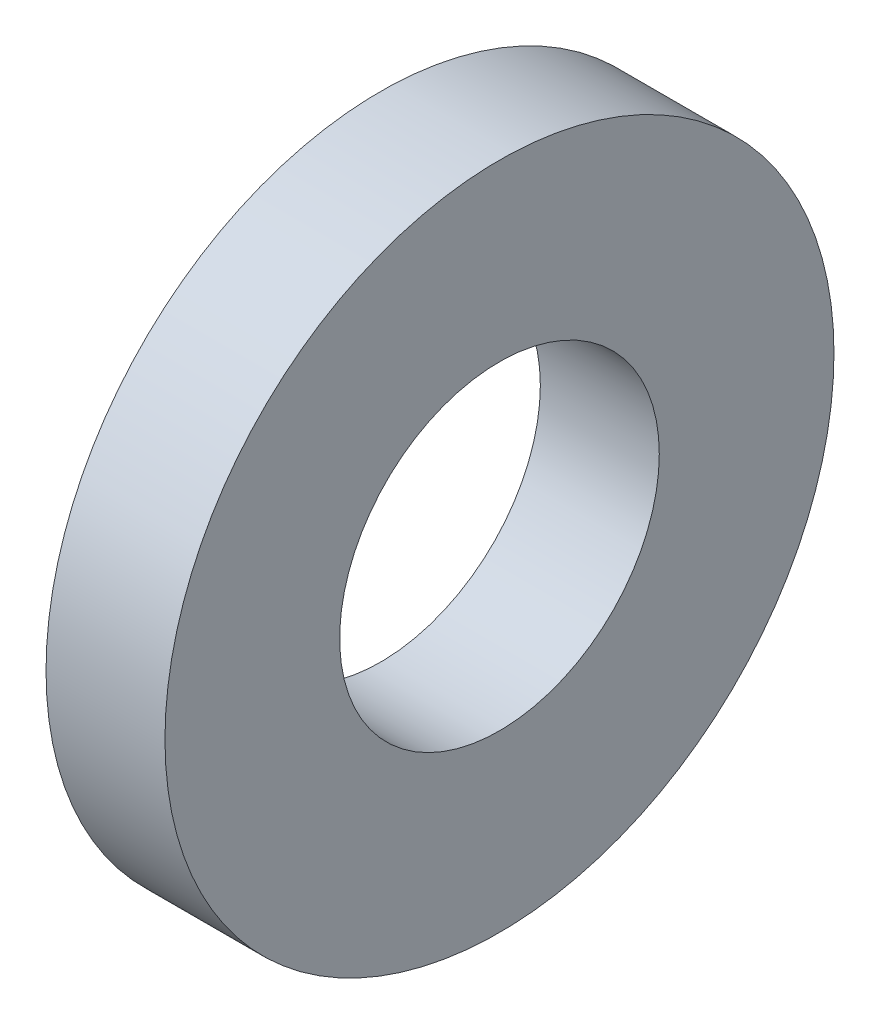
ISO-10303-21;
HEADER;
FILE_DESCRIPTION(('STEP AP214'),'2;1');
FILE_NAME('part.step','',(''),(''),'','','');
FILE_SCHEMA(('AUTOMOTIVE_DESIGN { 1 0 10303 214 1 1 1 1 }'));
ENDSEC;
DATA;
#1=APPLICATION_CONTEXT('core data for automotive mechanical design processes');
#2=APPLICATION_PROTOCOL_DEFINITION('international standard','automotive_design',2000,#1);
#3=PRODUCT_CONTEXT('',#1,'mechanical');
#4=PRODUCT('Part','Part','',(#3));
#5=PRODUCT_RELATED_PRODUCT_CATEGORY('part','',(#4));
#6=PRODUCT_DEFINITION_FORMATION('','',#4);
#7=PRODUCT_DEFINITION_CONTEXT('part definition',#1,'design');
#8=PRODUCT_DEFINITION('design','',#6,#7);
#9=PRODUCT_DEFINITION_SHAPE('','',#8);
#10=(LENGTH_UNIT() NAMED_UNIT(*) SI_UNIT(.MILLI.,.METRE.));
#11=(NAMED_UNIT(*) PLANE_ANGLE_UNIT() SI_UNIT($,.RADIAN.));
#12=(NAMED_UNIT(*) SI_UNIT($,.STERADIAN.) SOLID_ANGLE_UNIT());
#13=UNCERTAINTY_MEASURE_WITH_UNIT(LENGTH_MEASURE(1.E-05),#10,'distance_accuracy_value','');
#14=(GEOMETRIC_REPRESENTATION_CONTEXT(3) GLOBAL_UNCERTAINTY_ASSIGNED_CONTEXT((#13)) GLOBAL_UNIT_ASSIGNED_CONTEXT((#10,
#11,#12)) REPRESENTATION_CONTEXT('',''));
#15=CARTESIAN_POINT('',(0.,0.,0.));
#16=DIRECTION('',(0.,0.,1.));
#17=DIRECTION('',(1.,0.,0.));
#18=AXIS2_PLACEMENT_3D('',#15,#16,#17);
#19=CARTESIAN_POINT('',(0.4,0.,0.));
#20=DIRECTION('',(1.,0.,0.));
#21=DIRECTION('',(0.,0.,-1.));
#22=AXIS2_PLACEMENT_3D('',#19,#20,#21);
#23=CYLINDRICAL_SURFACE('',#22,2.15);
#24=CARTESIAN_POINT('',(-0.4,0.,0.));
#25=DIRECTION('',(1.,0.,0.));
#26=DIRECTION('',(0.,0.,-1.));
#27=AXIS2_PLACEMENT_3D('',#24,#25,#26);
#28=CIRCLE('',#27,2.15);
#29=CARTESIAN_POINT('',(-0.4,0.,-2.15));
#30=VERTEX_POINT('',#29);
#31=EDGE_CURVE('E11',#30,#30,#28,.T.);
#32=ORIENTED_EDGE('',*,*,#31,.F.);
#33=EDGE_LOOP('',(#32));
#34=FACE_BOUND('',#33,.T.);
#35=CARTESIAN_POINT('',(1.2,0.,0.));
#36=DIRECTION('',(1.,0.,0.));
#37=DIRECTION('',(0.,0.,-1.));
#38=AXIS2_PLACEMENT_3D('',#35,#36,#37);
#39=CIRCLE('',#38,2.15);
#40=CARTESIAN_POINT('',(1.2,0.,-2.15));
#41=VERTEX_POINT('',#40);
#42=EDGE_CURVE('E73',#41,#41,#39,.T.);
#43=ORIENTED_EDGE('',*,*,#42,.T.);
#44=EDGE_LOOP('',(#43));
#45=FACE_BOUND('',#44,.T.);
#46=ADVANCED_FACE('F50',(#34,#45),#23,.F.);
#47=CARTESIAN_POINT('',(-0.4,4.5,0.));
#48=DIRECTION('',(-1.,0.,0.));
#49=DIRECTION('',(0.,0.,1.));
#50=AXIS2_PLACEMENT_3D('',#47,#48,#49);
#51=PLANE('',#50);
#52=CARTESIAN_POINT('',(-0.4,0.,0.));
#53=DIRECTION('',(1.,0.,0.));
#54=DIRECTION('',(0.,0.,-1.));
#55=AXIS2_PLACEMENT_3D('',#52,#53,#54);
#56=CIRCLE('',#55,4.5);
#57=CARTESIAN_POINT('',(-0.4,0.,-4.5));
#58=VERTEX_POINT('',#57);
#59=EDGE_CURVE('E54',#58,#58,#56,.T.);
#60=ORIENTED_EDGE('',*,*,#59,.F.);
#61=EDGE_LOOP('',(#60));
#62=FACE_BOUND('',#61,.T.);
#63=ORIENTED_EDGE('',*,*,#31,.T.);
#64=EDGE_LOOP('',(#63));
#65=FACE_BOUND('',#64,.T.);
#66=ADVANCED_FACE('F90',(#62,#65),#51,.T.);
#67=CARTESIAN_POINT('',(0.4,0.,0.));
#68=DIRECTION('',(1.,0.,0.));
#69=DIRECTION('',(0.,0.,-1.));
#70=AXIS2_PLACEMENT_3D('',#67,#68,#69);
#71=CYLINDRICAL_SURFACE('',#70,4.5);
#72=ORIENTED_EDGE('',*,*,#59,.T.);
#73=EDGE_LOOP('',(#72));
#74=FACE_BOUND('',#73,.T.);
#75=CARTESIAN_POINT('',(1.2,0.,0.));
#76=DIRECTION('',(1.,0.,0.));
#77=DIRECTION('',(0.,0.,-1.));
#78=AXIS2_PLACEMENT_3D('',#75,#76,#77);
#79=CIRCLE('',#78,4.5);
#80=CARTESIAN_POINT('',(1.2,0.,-4.5));
#81=VERTEX_POINT('',#80);
#82=EDGE_CURVE('E75',#81,#81,#79,.T.);
#83=ORIENTED_EDGE('',*,*,#82,.F.);
#84=EDGE_LOOP('',(#83));
#85=FACE_BOUND('',#84,.T.);
#86=ADVANCED_FACE('F68',(#74,#85),#71,.T.);
#87=CARTESIAN_POINT('',(1.2,0.,0.));
#88=DIRECTION('',(1.,0.,0.));
#89=DIRECTION('',(0.,0.,-1.));
#90=AXIS2_PLACEMENT_3D('',#87,#88,#89);
#91=PLANE('',#90);
#92=ORIENTED_EDGE('',*,*,#82,.T.);
#93=EDGE_LOOP('',(#92));
#94=FACE_BOUND('',#93,.T.);
#95=ORIENTED_EDGE('',*,*,#42,.F.);
#96=EDGE_LOOP('',(#95));
#97=FACE_BOUND('',#96,.T.);
#98=ADVANCED_FACE('F85',(#94,#97),#91,.T.);
#99=CLOSED_SHELL('',(#46,#66,#86,#98));
#100=MANIFOLD_SOLID_BREP('B2',#99);
#101=ADVANCED_BREP_SHAPE_REPRESENTATION('',(#18,#100),#14);
#102=SHAPE_DEFINITION_REPRESENTATION(#9,#101);
ENDSEC;
END-ISO-10303-21;
